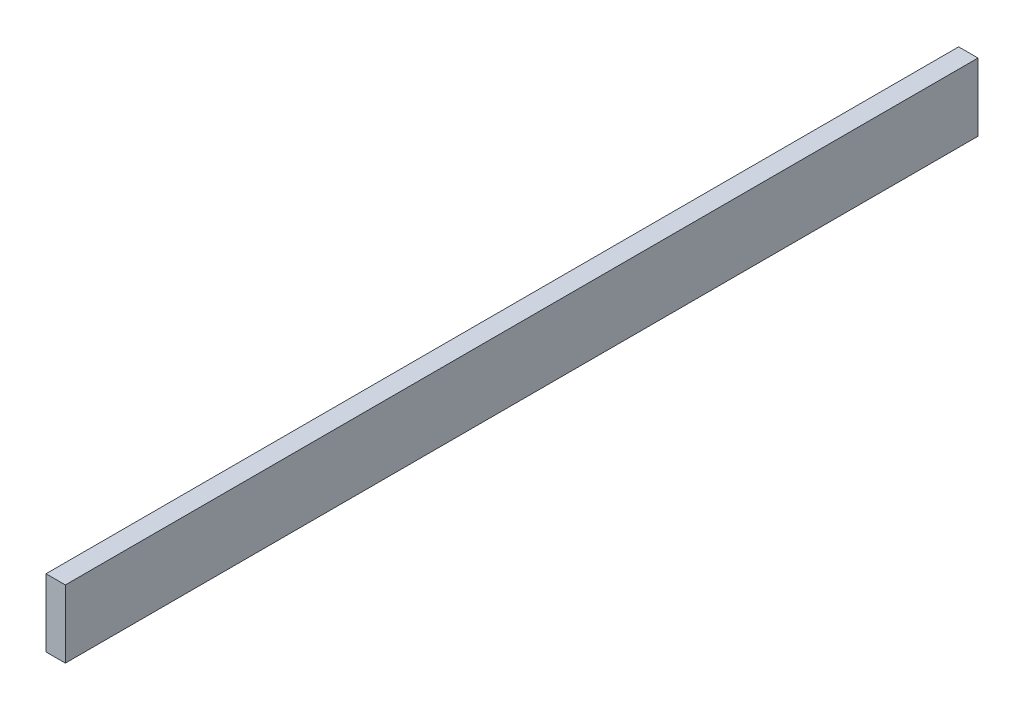
ISO-10303-21;
HEADER;
FILE_DESCRIPTION(('STEP AP214'),'2;1');
FILE_NAME('part.step','',(''),(''),'','','');
FILE_SCHEMA(('AUTOMOTIVE_DESIGN { 1 0 10303 214 1 1 1 1 }'));
ENDSEC;
DATA;
#1=APPLICATION_CONTEXT('core data for automotive mechanical design processes');
#2=APPLICATION_PROTOCOL_DEFINITION('international standard','automotive_design',2000,#1);
#3=PRODUCT_CONTEXT('',#1,'mechanical');
#4=PRODUCT('Part','Part','',(#3));
#5=PRODUCT_RELATED_PRODUCT_CATEGORY('part','',(#4));
#6=PRODUCT_DEFINITION_FORMATION('','',#4);
#7=PRODUCT_DEFINITION_CONTEXT('part definition',#1,'design');
#8=PRODUCT_DEFINITION('design','',#6,#7);
#9=PRODUCT_DEFINITION_SHAPE('','',#8);
#10=(LENGTH_UNIT() NAMED_UNIT(*) SI_UNIT(.MILLI.,.METRE.));
#11=(NAMED_UNIT(*) PLANE_ANGLE_UNIT() SI_UNIT($,.RADIAN.));
#12=(NAMED_UNIT(*) SI_UNIT($,.STERADIAN.) SOLID_ANGLE_UNIT());
#13=UNCERTAINTY_MEASURE_WITH_UNIT(LENGTH_MEASURE(1.E-05),#10,'distance_accuracy_value','');
#14=(GEOMETRIC_REPRESENTATION_CONTEXT(3) GLOBAL_UNCERTAINTY_ASSIGNED_CONTEXT((#13)) GLOBAL_UNIT_ASSIGNED_CONTEXT((#10,
#11,#12)) REPRESENTATION_CONTEXT('',''));
#15=CARTESIAN_POINT('',(0.,0.,0.));
#16=DIRECTION('',(0.,0.,1.));
#17=DIRECTION('',(1.,0.,0.));
#18=AXIS2_PLACEMENT_3D('',#15,#16,#17);
#19=CARTESIAN_POINT('',(0.,0.,-660.));
#20=DIRECTION('',(-1.,0.,0.));
#21=DIRECTION('',(0.,0.,1.));
#22=AXIS2_PLACEMENT_3D('',#19,#20,#21);
#23=PLANE('',#22);
#24=DIRECTION('',(0.,-1.,0.));
#25=VECTOR('',#24,1.);
#26=CARTESIAN_POINT('',(0.,0.,0.));
#27=LINE('',#26,#25);
#28=CARTESIAN_POINT('',(0.,49.,0.));
#29=VERTEX_POINT('',#28);
#30=CARTESIAN_POINT('',(0.,0.,0.));
#31=VERTEX_POINT('',#30);
#32=EDGE_CURVE('E103',#29,#31,#27,.T.);
#33=ORIENTED_EDGE('',*,*,#32,.F.);
#34=DIRECTION('',(0.,0.,1.));
#35=VECTOR('',#34,1.);
#36=CARTESIAN_POINT('',(0.,49.,-660.));
#37=LINE('',#36,#35);
#38=CARTESIAN_POINT('',(0.,49.,-660.));
#39=VERTEX_POINT('',#38);
#40=EDGE_CURVE('E11',#39,#29,#37,.T.);
#41=ORIENTED_EDGE('',*,*,#40,.F.);
#42=DIRECTION('',(0.,-1.,0.));
#43=VECTOR('',#42,1.);
#44=CARTESIAN_POINT('',(0.,0.,-660.));
#45=LINE('',#44,#43);
#46=CARTESIAN_POINT('',(0.,0.,-660.));
#47=VERTEX_POINT('',#46);
#48=EDGE_CURVE('E97',#39,#47,#45,.T.);
#49=ORIENTED_EDGE('',*,*,#48,.T.);
#50=DIRECTION('',(0.,0.,1.));
#51=VECTOR('',#50,1.);
#52=CARTESIAN_POINT('',(0.,0.,-660.));
#53=LINE('',#52,#51);
#54=EDGE_CURVE('E42',#47,#31,#53,.T.);
#55=ORIENTED_EDGE('',*,*,#54,.T.);
#56=EDGE_LOOP('',(#33,#41,#49,#55));
#57=FACE_BOUND('',#56,.T.);
#58=ADVANCED_FACE('F39',(#57),#23,.T.);
#59=CARTESIAN_POINT('',(0.,49.,-660.));
#60=DIRECTION('',(0.,1.,0.));
#61=DIRECTION('',(0.,0.,1.));
#62=AXIS2_PLACEMENT_3D('',#59,#60,#61);
#63=PLANE('',#62);
#64=DIRECTION('',(-1.,0.,0.));
#65=VECTOR('',#64,1.);
#66=CARTESIAN_POINT('',(0.,49.,0.));
#67=LINE('',#66,#65);
#68=CARTESIAN_POINT('',(14.,49.,0.));
#69=VERTEX_POINT('',#68);
#70=EDGE_CURVE('E99',#69,#29,#67,.T.);
#71=ORIENTED_EDGE('',*,*,#70,.F.);
#72=DIRECTION('',(0.,0.,1.));
#73=VECTOR('',#72,1.);
#74=CARTESIAN_POINT('',(14.,49.,-660.));
#75=LINE('',#74,#73);
#76=CARTESIAN_POINT('',(14.,49.,-660.));
#77=VERTEX_POINT('',#76);
#78=EDGE_CURVE('E48',#77,#69,#75,.T.);
#79=ORIENTED_EDGE('',*,*,#78,.F.);
#80=DIRECTION('',(-1.,0.,0.));
#81=VECTOR('',#80,1.);
#82=CARTESIAN_POINT('',(0.,49.,-660.));
#83=LINE('',#82,#81);
#84=EDGE_CURVE('E94',#77,#39,#83,.T.);
#85=ORIENTED_EDGE('',*,*,#84,.T.);
#86=ORIENTED_EDGE('',*,*,#40,.T.);
#87=EDGE_LOOP('',(#71,#79,#85,#86));
#88=FACE_BOUND('',#87,.T.);
#89=ADVANCED_FACE('F113',(#88),#63,.T.);
#90=CARTESIAN_POINT('',(14.,0.,-660.));
#91=DIRECTION('',(1.,0.,0.));
#92=DIRECTION('',(0.,0.,-1.));
#93=AXIS2_PLACEMENT_3D('',#90,#91,#92);
#94=PLANE('',#93);
#95=DIRECTION('',(0.,1.,0.));
#96=VECTOR('',#95,1.);
#97=CARTESIAN_POINT('',(14.,0.,0.));
#98=LINE('',#97,#96);
#99=CARTESIAN_POINT('',(14.,0.,0.));
#100=VERTEX_POINT('',#99);
#101=EDGE_CURVE('E89',#100,#69,#98,.T.);
#102=ORIENTED_EDGE('',*,*,#101,.F.);
#103=DIRECTION('',(0.,0.,1.));
#104=VECTOR('',#103,1.);
#105=CARTESIAN_POINT('',(14.,0.,-660.));
#106=LINE('',#105,#104);
#107=CARTESIAN_POINT('',(14.,0.,-660.));
#108=VERTEX_POINT('',#107);
#109=EDGE_CURVE('E84',#108,#100,#106,.T.);
#110=ORIENTED_EDGE('',*,*,#109,.F.);
#111=DIRECTION('',(0.,1.,0.));
#112=VECTOR('',#111,1.);
#113=CARTESIAN_POINT('',(14.,0.,-660.));
#114=LINE('',#113,#112);
#115=EDGE_CURVE('E87',#108,#77,#114,.T.);
#116=ORIENTED_EDGE('',*,*,#115,.T.);
#117=ORIENTED_EDGE('',*,*,#78,.T.);
#118=EDGE_LOOP('',(#102,#110,#116,#117));
#119=FACE_BOUND('',#118,.T.);
#120=ADVANCED_FACE('F86',(#119),#94,.T.);
#121=CARTESIAN_POINT('',(0.,0.,-660.));
#122=DIRECTION('',(0.,-1.,0.));
#123=DIRECTION('',(0.,0.,-1.));
#124=AXIS2_PLACEMENT_3D('',#121,#122,#123);
#125=PLANE('',#124);
#126=DIRECTION('',(1.,0.,0.));
#127=VECTOR('',#126,1.);
#128=CARTESIAN_POINT('',(0.,0.,0.));
#129=LINE('',#128,#127);
#130=EDGE_CURVE('E106',#31,#100,#129,.T.);
#131=ORIENTED_EDGE('',*,*,#130,.F.);
#132=ORIENTED_EDGE('',*,*,#54,.F.);
#133=DIRECTION('',(1.,0.,0.));
#134=VECTOR('',#133,1.);
#135=CARTESIAN_POINT('',(0.,0.,-660.));
#136=LINE('',#135,#134);
#137=EDGE_CURVE('E93',#47,#108,#136,.T.);
#138=ORIENTED_EDGE('',*,*,#137,.T.);
#139=ORIENTED_EDGE('',*,*,#109,.T.);
#140=EDGE_LOOP('',(#131,#132,#138,#139));
#141=FACE_BOUND('',#140,.T.);
#142=ADVANCED_FACE('F96',(#141),#125,.T.);
#143=CARTESIAN_POINT('',(0.,0.,-660.));
#144=DIRECTION('',(0.,0.,-1.));
#145=DIRECTION('',(-1.,0.,0.));
#146=AXIS2_PLACEMENT_3D('',#143,#144,#145);
#147=PLANE('',#146);
#148=ORIENTED_EDGE('',*,*,#48,.F.);
#149=ORIENTED_EDGE('',*,*,#84,.F.);
#150=ORIENTED_EDGE('',*,*,#115,.F.);
#151=ORIENTED_EDGE('',*,*,#137,.F.);
#152=EDGE_LOOP('',(#148,#149,#150,#151));
#153=FACE_BOUND('',#152,.T.);
#154=ADVANCED_FACE('F92',(#153),#147,.T.);
#155=CARTESIAN_POINT('',(0.,0.,0.));
#156=DIRECTION('',(0.,0.,-1.));
#157=DIRECTION('',(-1.,0.,0.));
#158=AXIS2_PLACEMENT_3D('',#155,#156,#157);
#159=PLANE('',#158);
#160=ORIENTED_EDGE('',*,*,#32,.T.);
#161=ORIENTED_EDGE('',*,*,#130,.T.);
#162=ORIENTED_EDGE('',*,*,#101,.T.);
#163=ORIENTED_EDGE('',*,*,#70,.T.);
#164=EDGE_LOOP('',(#160,#161,#162,#163));
#165=FACE_BOUND('',#164,.T.);
#166=ADVANCED_FACE('F112',(#165),#159,.F.);
#167=CLOSED_SHELL('',(#58,#89,#120,#142,#154,#166));
#168=MANIFOLD_SOLID_BREP('B2',#167);
#169=ADVANCED_BREP_SHAPE_REPRESENTATION('',(#18,#168),#14);
#170=SHAPE_DEFINITION_REPRESENTATION(#9,#169);
ENDSEC;
END-ISO-10303-21;
